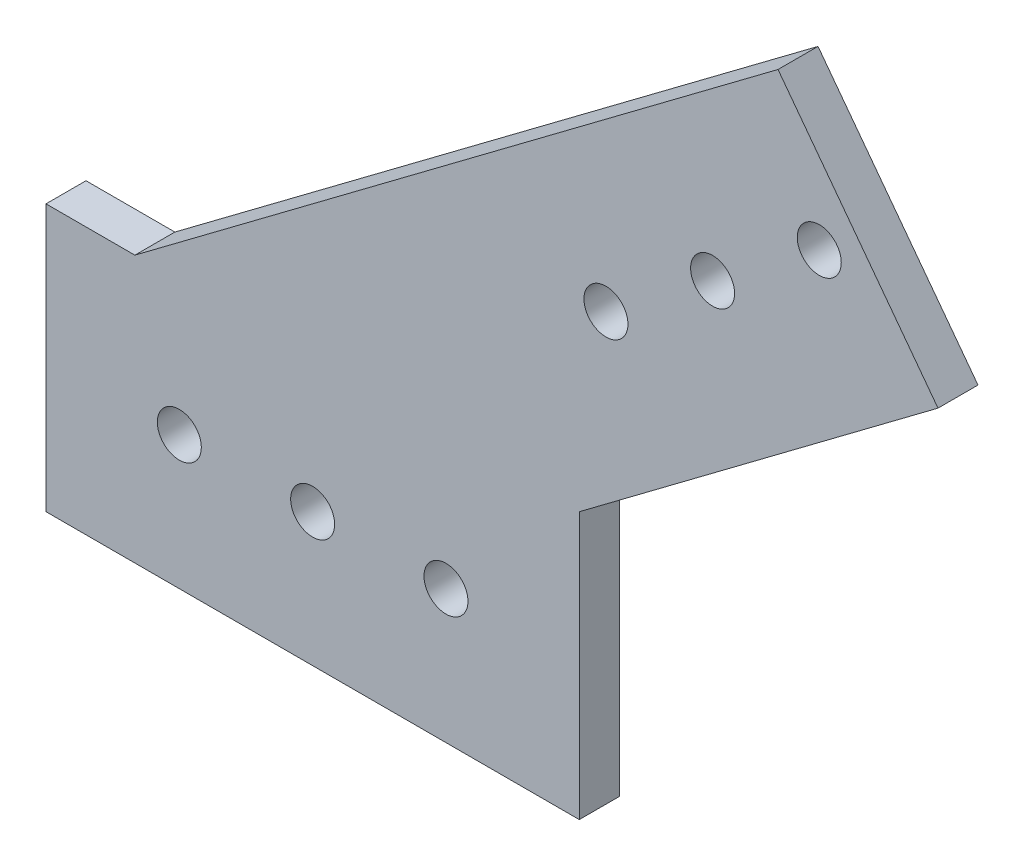
ISO-10303-21;
HEADER;
FILE_DESCRIPTION(('STEP AP214'),'2;1');
FILE_NAME('part.step','',(''),(''),'','','');
FILE_SCHEMA(('AUTOMOTIVE_DESIGN { 1 0 10303 214 1 1 1 1 }'));
ENDSEC;
DATA;
#1=APPLICATION_CONTEXT('core data for automotive mechanical design processes');
#2=APPLICATION_PROTOCOL_DEFINITION('international standard','automotive_design',2000,#1);
#3=PRODUCT_CONTEXT('',#1,'mechanical');
#4=PRODUCT('Part','Part','',(#3));
#5=PRODUCT_RELATED_PRODUCT_CATEGORY('part','',(#4));
#6=PRODUCT_DEFINITION_FORMATION('','',#4);
#7=PRODUCT_DEFINITION_CONTEXT('part definition',#1,'design');
#8=PRODUCT_DEFINITION('design','',#6,#7);
#9=PRODUCT_DEFINITION_SHAPE('','',#8);
#10=(LENGTH_UNIT() NAMED_UNIT(*) SI_UNIT(.MILLI.,.METRE.));
#11=(NAMED_UNIT(*) PLANE_ANGLE_UNIT() SI_UNIT($,.RADIAN.));
#12=(NAMED_UNIT(*) SI_UNIT($,.STERADIAN.) SOLID_ANGLE_UNIT());
#13=UNCERTAINTY_MEASURE_WITH_UNIT(LENGTH_MEASURE(1.E-05),#10,'distance_accuracy_value','');
#14=(GEOMETRIC_REPRESENTATION_CONTEXT(3) GLOBAL_UNCERTAINTY_ASSIGNED_CONTEXT((#13)) GLOBAL_UNIT_ASSIGNED_CONTEXT((#10,
#11,#12)) REPRESENTATION_CONTEXT('',''));
#15=CARTESIAN_POINT('',(0.,0.,0.));
#16=DIRECTION('',(0.,0.,1.));
#17=DIRECTION('',(1.,0.,0.));
#18=AXIS2_PLACEMENT_3D('',#15,#16,#17);
#19=CARTESIAN_POINT('',(0.,0.,3.));
#20=DIRECTION('',(0.,0.,-1.));
#21=DIRECTION('',(-1.,0.,0.));
#22=AXIS2_PLACEMENT_3D('',#19,#20,#21);
#23=PLANE('',#22);
#24=DIRECTION('',(0.79999993862181,0.600000081837578,0.));
#25=VECTOR('',#24,1.);
#26=CARTESIAN_POINT('',(14.5026314242211,-8.06225338048749,3.));
#27=LINE('',#26,#25);
#28=CARTESIAN_POINT('',(14.5026314242211,-8.06225338048749,3.));
#29=VERTEX_POINT('',#28);
#30=CARTESIAN_POINT('',(41.4088510684025,12.1174156533128,3.));
#31=VERTEX_POINT('',#30);
#32=EDGE_CURVE('E145',#29,#31,#27,.T.);
#33=ORIENTED_EDGE('',*,*,#32,.T.);
#34=DIRECTION('',(-0.600000081837578,0.79999993862181,0.));
#35=VECTOR('',#34,1.);
#36=CARTESIAN_POINT('',(29.4088494316509,28.1174144257491,3.));
#37=LINE('',#36,#35);
#38=CARTESIAN_POINT('',(29.4088494316509,28.1174144257491,3.));
#39=VERTEX_POINT('',#38);
#40=EDGE_CURVE('E98',#31,#39,#37,.T.);
#41=ORIENTED_EDGE('',*,*,#40,.T.);
#42=DIRECTION('',(-0.79999993862181,-0.600000081837578,0.));
#43=VECTOR('',#42,1.);
#44=CARTESIAN_POINT('',(-18.8306973625809,-8.06225338048749,3.));
#45=LINE('',#44,#43);
#46=CARTESIAN_POINT('',(-18.8306973625809,-8.06225338048749,3.));
#47=VERTEX_POINT('',#46);
#48=EDGE_CURVE('E157',#39,#47,#45,.T.);
#49=ORIENTED_EDGE('',*,*,#48,.T.);
#50=DIRECTION('',(-1.,0.,0.));
#51=VECTOR('',#50,1.);
#52=CARTESIAN_POINT('',(-18.8306973625809,-8.06225338048749,3.));
#53=LINE('',#52,#51);
#54=CARTESIAN_POINT('',(-25.4973634609303,-8.06225338048749,3.));
#55=VERTEX_POINT('',#54);
#56=EDGE_CURVE('E114',#47,#55,#53,.T.);
#57=ORIENTED_EDGE('',*,*,#56,.T.);
#58=DIRECTION('',(0.,-1.,0.));
#59=VECTOR('',#58,1.);
#60=CARTESIAN_POINT('',(-25.4973634609303,-8.06225338048749,3.));
#61=LINE('',#60,#59);
#62=CARTESIAN_POINT('',(-25.4973634609303,-28.0622533804875,3.));
#63=VERTEX_POINT('',#62);
#64=EDGE_CURVE('E108',#55,#63,#61,.T.);
#65=ORIENTED_EDGE('',*,*,#64,.T.);
#66=DIRECTION('',(1.,0.,0.));
#67=VECTOR('',#66,1.);
#68=CARTESIAN_POINT('',(-25.4973634609303,-28.0622533804875,3.));
#69=LINE('',#68,#67);
#70=CARTESIAN_POINT('',(14.5026314242211,-28.0622533804875,3.));
#71=VERTEX_POINT('',#70);
#72=EDGE_CURVE('E112',#63,#71,#69,.T.);
#73=ORIENTED_EDGE('',*,*,#72,.T.);
#74=DIRECTION('',(0.,1.,0.));
#75=VECTOR('',#74,1.);
#76=CARTESIAN_POINT('',(14.5026314242211,-28.0622533804875,3.));
#77=LINE('',#76,#75);
#78=EDGE_CURVE('E58',#71,#29,#77,.T.);
#79=ORIENTED_EDGE('',*,*,#78,.T.);
#80=EDGE_LOOP('',(#33,#41,#49,#57,#65,#73,#79));
#81=FACE_BOUND('',#80,.T.);
#82=CARTESIAN_POINT('',(-5.49736346093079,-18.0622533804874,3.));
#83=DIRECTION('',(0.,0.,1.));
#84=DIRECTION('',(1.,0.,0.));
#85=AXIS2_PLACEMENT_3D('',#82,#83,#84);
#86=CIRCLE('',#85,1.65000000000028);
#87=CARTESIAN_POINT('',(-3.84736346093051,-18.0622533804874,3.));
#88=VERTEX_POINT('',#87);
#89=EDGE_CURVE('E136',#88,#88,#86,.T.);
#90=ORIENTED_EDGE('',*,*,#89,.F.);
#91=EDGE_LOOP('',(#90));
#92=FACE_BOUND('',#91,.T.);
#93=CARTESIAN_POINT('',(4.502636539069,-18.0622533804874,3.));
#94=DIRECTION('',(0.,0.,1.));
#95=DIRECTION('',(1.,0.,0.));
#96=AXIS2_PLACEMENT_3D('',#93,#94,#95);
#97=CIRCLE('',#96,1.65000000000027);
#98=CARTESIAN_POINT('',(6.15263653906927,-18.0622533804874,3.));
#99=VERTEX_POINT('',#98);
#100=EDGE_CURVE('E172',#99,#99,#97,.T.);
#101=ORIENTED_EDGE('',*,*,#100,.F.);
#102=EDGE_LOOP('',(#101));
#103=FACE_BOUND('',#102,.T.);
#104=CARTESIAN_POINT('',(-15.4973634609306,-18.0622533804874,3.));
#105=DIRECTION('',(0.,0.,1.));
#106=DIRECTION('',(1.,0.,0.));
#107=AXIS2_PLACEMENT_3D('',#104,#105,#106);
#108=CIRCLE('',#107,1.65000000000027);
#109=CARTESIAN_POINT('',(-13.8473634609303,-18.0622533804874,3.));
#110=VERTEX_POINT('',#109);
#111=EDGE_CURVE('E178',#110,#110,#108,.T.);
#112=ORIENTED_EDGE('',*,*,#111,.F.);
#113=EDGE_LOOP('',(#112));
#114=FACE_BOUND('',#113,.T.);
#115=CARTESIAN_POINT('',(16.5026299920635,5.93774682410637,3.));
#116=DIRECTION('',(0.,0.,1.));
#117=DIRECTION('',(1.,0.,0.));
#118=AXIS2_PLACEMENT_3D('',#115,#116,#117);
#119=CIRCLE('',#118,1.65000000000024);
#120=CARTESIAN_POINT('',(18.1526299920637,5.93774682410637,3.));
#121=VERTEX_POINT('',#120);
#122=EDGE_CURVE('E184',#121,#121,#119,.T.);
#123=ORIENTED_EDGE('',*,*,#122,.F.);
#124=EDGE_LOOP('',(#123));
#125=FACE_BOUND('',#124,.T.);
#126=CARTESIAN_POINT('',(24.5026293782816,11.9377476424822,3.));
#127=DIRECTION('',(0.,0.,1.));
#128=DIRECTION('',(1.,0.,0.));
#129=AXIS2_PLACEMENT_3D('',#126,#127,#128);
#130=CIRCLE('',#129,1.6500000000003);
#131=CARTESIAN_POINT('',(26.1526293782819,11.9377476424822,3.));
#132=VERTEX_POINT('',#131);
#133=EDGE_CURVE('E190',#132,#132,#130,.T.);
#134=ORIENTED_EDGE('',*,*,#133,.F.);
#135=EDGE_LOOP('',(#134));
#136=FACE_BOUND('',#135,.T.);
#137=CARTESIAN_POINT('',(32.5026287644997,17.9377484608579,3.));
#138=DIRECTION('',(0.,0.,1.));
#139=DIRECTION('',(1.,0.,0.));
#140=AXIS2_PLACEMENT_3D('',#137,#138,#139);
#141=CIRCLE('',#140,1.65000000000022);
#142=CARTESIAN_POINT('',(34.1526287644999,17.9377484608579,3.));
#143=VERTEX_POINT('',#142);
#144=EDGE_CURVE('E196',#143,#143,#141,.T.);
#145=ORIENTED_EDGE('',*,*,#144,.F.);
#146=EDGE_LOOP('',(#145));
#147=FACE_BOUND('',#146,.T.);
#148=ADVANCED_FACE('F41',(#81,#92,#103,#114,#125,#136,#147),#23,.F.);
#149=CARTESIAN_POINT('',(0.,0.,0.));
#150=DIRECTION('',(0.,0.,-1.));
#151=DIRECTION('',(-1.,0.,0.));
#152=AXIS2_PLACEMENT_3D('',#149,#150,#151);
#153=PLANE('',#152);
#154=CARTESIAN_POINT('',(24.5026293782816,11.9377476424822,0.));
#155=DIRECTION('',(0.,0.,1.));
#156=DIRECTION('',(1.,0.,0.));
#157=AXIS2_PLACEMENT_3D('',#154,#155,#156);
#158=CIRCLE('',#157,1.6500000000003);
#159=CARTESIAN_POINT('',(26.1526293782819,11.9377476424822,0.));
#160=VERTEX_POINT('',#159);
#161=EDGE_CURVE('E193',#160,#160,#158,.T.);
#162=ORIENTED_EDGE('',*,*,#161,.T.);
#163=EDGE_LOOP('',(#162));
#164=FACE_BOUND('',#163,.T.);
#165=CARTESIAN_POINT('',(-15.4973634609306,-18.0622533804874,0.));
#166=DIRECTION('',(0.,0.,1.));
#167=DIRECTION('',(1.,0.,0.));
#168=AXIS2_PLACEMENT_3D('',#165,#166,#167);
#169=CIRCLE('',#168,1.65000000000027);
#170=CARTESIAN_POINT('',(-13.8473634609303,-18.0622533804874,0.));
#171=VERTEX_POINT('',#170);
#172=EDGE_CURVE('E181',#171,#171,#169,.T.);
#173=ORIENTED_EDGE('',*,*,#172,.T.);
#174=EDGE_LOOP('',(#173));
#175=FACE_BOUND('',#174,.T.);
#176=CARTESIAN_POINT('',(-5.49736346093079,-18.0622533804874,0.));
#177=DIRECTION('',(0.,0.,1.));
#178=DIRECTION('',(1.,0.,0.));
#179=AXIS2_PLACEMENT_3D('',#176,#177,#178);
#180=CIRCLE('',#179,1.65000000000028);
#181=CARTESIAN_POINT('',(-3.84736346093051,-18.0622533804874,0.));
#182=VERTEX_POINT('',#181);
#183=EDGE_CURVE('E169',#182,#182,#180,.T.);
#184=ORIENTED_EDGE('',*,*,#183,.T.);
#185=EDGE_LOOP('',(#184));
#186=FACE_BOUND('',#185,.T.);
#187=DIRECTION('',(0.79999993862181,0.600000081837578,0.));
#188=VECTOR('',#187,1.);
#189=CARTESIAN_POINT('',(14.5026314242211,-8.06225338048749,0.));
#190=LINE('',#189,#188);
#191=CARTESIAN_POINT('',(14.5026314242211,-8.06225338048749,0.));
#192=VERTEX_POINT('',#191);
#193=CARTESIAN_POINT('',(41.4088510684025,12.1174156533128,0.));
#194=VERTEX_POINT('',#193);
#195=EDGE_CURVE('E132',#192,#194,#190,.T.);
#196=ORIENTED_EDGE('',*,*,#195,.F.);
#197=DIRECTION('',(0.,1.,0.));
#198=VECTOR('',#197,1.);
#199=CARTESIAN_POINT('',(14.5026314242211,-28.0622533804875,0.));
#200=LINE('',#199,#198);
#201=CARTESIAN_POINT('',(14.5026314242211,-28.0622533804875,0.));
#202=VERTEX_POINT('',#201);
#203=EDGE_CURVE('E90',#202,#192,#200,.T.);
#204=ORIENTED_EDGE('',*,*,#203,.F.);
#205=DIRECTION('',(1.,0.,0.));
#206=VECTOR('',#205,1.);
#207=CARTESIAN_POINT('',(-25.4973634609303,-28.0622533804875,0.));
#208=LINE('',#207,#206);
#209=CARTESIAN_POINT('',(-25.4973634609303,-28.0622533804875,0.));
#210=VERTEX_POINT('',#209);
#211=EDGE_CURVE('E84',#210,#202,#208,.T.);
#212=ORIENTED_EDGE('',*,*,#211,.F.);
#213=DIRECTION('',(0.,-1.,0.));
#214=VECTOR('',#213,1.);
#215=CARTESIAN_POINT('',(-25.4973634609303,-8.06225338048749,0.));
#216=LINE('',#215,#214);
#217=CARTESIAN_POINT('',(-25.4973634609303,-8.06225338048749,0.));
#218=VERTEX_POINT('',#217);
#219=EDGE_CURVE('E122',#218,#210,#216,.T.);
#220=ORIENTED_EDGE('',*,*,#219,.F.);
#221=DIRECTION('',(-1.,0.,0.));
#222=VECTOR('',#221,1.);
#223=CARTESIAN_POINT('',(-18.8306973625809,-8.06225338048749,0.));
#224=LINE('',#223,#222);
#225=CARTESIAN_POINT('',(-18.8306973625809,-8.06225338048749,0.));
#226=VERTEX_POINT('',#225);
#227=EDGE_CURVE('E140',#226,#218,#224,.T.);
#228=ORIENTED_EDGE('',*,*,#227,.F.);
#229=DIRECTION('',(-0.79999993862181,-0.600000081837578,0.));
#230=VECTOR('',#229,1.);
#231=CARTESIAN_POINT('',(-18.8306973625809,-8.06225338048749,0.));
#232=LINE('',#231,#230);
#233=CARTESIAN_POINT('',(29.4088494316509,28.1174144257491,0.));
#234=VERTEX_POINT('',#233);
#235=EDGE_CURVE('E138',#234,#226,#232,.T.);
#236=ORIENTED_EDGE('',*,*,#235,.F.);
#237=DIRECTION('',(-0.600000081837578,0.79999993862181,0.));
#238=VECTOR('',#237,1.);
#239=CARTESIAN_POINT('',(29.4088494316509,28.1174144257491,0.));
#240=LINE('',#239,#238);
#241=EDGE_CURVE('E135',#194,#234,#240,.T.);
#242=ORIENTED_EDGE('',*,*,#241,.F.);
#243=EDGE_LOOP('',(#196,#204,#212,#220,#228,#236,#242));
#244=FACE_BOUND('',#243,.T.);
#245=CARTESIAN_POINT('',(4.502636539069,-18.0622533804874,0.));
#246=DIRECTION('',(0.,0.,1.));
#247=DIRECTION('',(1.,0.,0.));
#248=AXIS2_PLACEMENT_3D('',#245,#246,#247);
#249=CIRCLE('',#248,1.65000000000027);
#250=CARTESIAN_POINT('',(6.15263653906927,-18.0622533804874,0.));
#251=VERTEX_POINT('',#250);
#252=EDGE_CURVE('E175',#251,#251,#249,.T.);
#253=ORIENTED_EDGE('',*,*,#252,.T.);
#254=EDGE_LOOP('',(#253));
#255=FACE_BOUND('',#254,.T.);
#256=CARTESIAN_POINT('',(16.5026299920635,5.93774682410637,0.));
#257=DIRECTION('',(0.,0.,1.));
#258=DIRECTION('',(1.,0.,0.));
#259=AXIS2_PLACEMENT_3D('',#256,#257,#258);
#260=CIRCLE('',#259,1.65000000000024);
#261=CARTESIAN_POINT('',(18.1526299920637,5.93774682410637,0.));
#262=VERTEX_POINT('',#261);
#263=EDGE_CURVE('E187',#262,#262,#260,.T.);
#264=ORIENTED_EDGE('',*,*,#263,.T.);
#265=EDGE_LOOP('',(#264));
#266=FACE_BOUND('',#265,.T.);
#267=CARTESIAN_POINT('',(32.5026287644997,17.9377484608579,0.));
#268=DIRECTION('',(0.,0.,1.));
#269=DIRECTION('',(1.,0.,0.));
#270=AXIS2_PLACEMENT_3D('',#267,#268,#269);
#271=CIRCLE('',#270,1.65000000000022);
#272=CARTESIAN_POINT('',(34.1526287644999,17.9377484608579,0.));
#273=VERTEX_POINT('',#272);
#274=EDGE_CURVE('E199',#273,#273,#271,.T.);
#275=ORIENTED_EDGE('',*,*,#274,.T.);
#276=EDGE_LOOP('',(#275));
#277=FACE_BOUND('',#276,.T.);
#278=ADVANCED_FACE('F161',(#164,#175,#186,#244,#255,#266,#277),#153,.T.);
#279=CARTESIAN_POINT('',(14.5026314242211,-8.06225338048749,3.));
#280=DIRECTION('',(-0.600000081837578,0.79999993862181,0.));
#281=DIRECTION('',(-0.79999993862181,-0.600000081837578,0.));
#282=AXIS2_PLACEMENT_3D('',#279,#280,#281);
#283=PLANE('',#282);
#284=ORIENTED_EDGE('',*,*,#195,.T.);
#285=DIRECTION('',(0.,0.,-1.));
#286=VECTOR('',#285,1.);
#287=CARTESIAN_POINT('',(41.4088510684025,12.1174156533128,3.));
#288=LINE('',#287,#286);
#289=EDGE_CURVE('E11',#31,#194,#288,.T.);
#290=ORIENTED_EDGE('',*,*,#289,.F.);
#291=ORIENTED_EDGE('',*,*,#32,.F.);
#292=DIRECTION('',(0.,0.,-1.));
#293=VECTOR('',#292,1.);
#294=CARTESIAN_POINT('',(14.5026314242211,-8.06225338048749,3.));
#295=LINE('',#294,#293);
#296=EDGE_CURVE('E128',#29,#192,#295,.T.);
#297=ORIENTED_EDGE('',*,*,#296,.T.);
#298=EDGE_LOOP('',(#284,#290,#291,#297));
#299=FACE_BOUND('',#298,.T.);
#300=ADVANCED_FACE('F43',(#299),#283,.F.);
#301=CARTESIAN_POINT('',(29.4088494316509,28.1174144257491,3.));
#302=DIRECTION('',(-0.79999993862181,-0.600000081837578,0.));
#303=DIRECTION('',(0.600000081837578,-0.79999993862181,0.));
#304=AXIS2_PLACEMENT_3D('',#301,#302,#303);
#305=PLANE('',#304);
#306=ORIENTED_EDGE('',*,*,#241,.T.);
#307=DIRECTION('',(0.,0.,-1.));
#308=VECTOR('',#307,1.);
#309=CARTESIAN_POINT('',(29.4088494316509,28.1174144257491,3.));
#310=LINE('',#309,#308);
#311=EDGE_CURVE('E50',#39,#234,#310,.T.);
#312=ORIENTED_EDGE('',*,*,#311,.F.);
#313=ORIENTED_EDGE('',*,*,#40,.F.);
#314=ORIENTED_EDGE('',*,*,#289,.T.);
#315=EDGE_LOOP('',(#306,#312,#313,#314));
#316=FACE_BOUND('',#315,.T.);
#317=ADVANCED_FACE('F229',(#316),#305,.F.);
#318=CARTESIAN_POINT('',(-18.8306973625809,-8.06225338048749,3.));
#319=DIRECTION('',(0.600000081837578,-0.79999993862181,0.));
#320=DIRECTION('',(0.79999993862181,0.600000081837578,0.));
#321=AXIS2_PLACEMENT_3D('',#318,#319,#320);
#322=PLANE('',#321);
#323=ORIENTED_EDGE('',*,*,#235,.T.);
#324=DIRECTION('',(0.,0.,-1.));
#325=VECTOR('',#324,1.);
#326=CARTESIAN_POINT('',(-18.8306973625809,-8.06225338048749,3.));
#327=LINE('',#326,#325);
#328=EDGE_CURVE('E149',#47,#226,#327,.T.);
#329=ORIENTED_EDGE('',*,*,#328,.F.);
#330=ORIENTED_EDGE('',*,*,#48,.F.);
#331=ORIENTED_EDGE('',*,*,#311,.T.);
#332=EDGE_LOOP('',(#323,#329,#330,#331));
#333=FACE_BOUND('',#332,.T.);
#334=ADVANCED_FACE('F155',(#333),#322,.F.);
#335=CARTESIAN_POINT('',(-18.8306973625809,-8.06225338048749,3.));
#336=DIRECTION('',(0.,-1.,0.));
#337=DIRECTION('',(0.,0.,-1.));
#338=AXIS2_PLACEMENT_3D('',#335,#336,#337);
#339=PLANE('',#338);
#340=ORIENTED_EDGE('',*,*,#227,.T.);
#341=DIRECTION('',(0.,0.,-1.));
#342=VECTOR('',#341,1.);
#343=CARTESIAN_POINT('',(-25.4973634609303,-8.06225338048749,3.));
#344=LINE('',#343,#342);
#345=EDGE_CURVE('E123',#55,#218,#344,.T.);
#346=ORIENTED_EDGE('',*,*,#345,.F.);
#347=ORIENTED_EDGE('',*,*,#56,.F.);
#348=ORIENTED_EDGE('',*,*,#328,.T.);
#349=EDGE_LOOP('',(#340,#346,#347,#348));
#350=FACE_BOUND('',#349,.T.);
#351=ADVANCED_FACE('F164',(#350),#339,.F.);
#352=CARTESIAN_POINT('',(-25.4973634609303,-8.06225338048749,3.));
#353=DIRECTION('',(1.,0.,0.));
#354=DIRECTION('',(0.,0.,-1.));
#355=AXIS2_PLACEMENT_3D('',#352,#353,#354);
#356=PLANE('',#355);
#357=ORIENTED_EDGE('',*,*,#219,.T.);
#358=DIRECTION('',(0.,0.,-1.));
#359=VECTOR('',#358,1.);
#360=CARTESIAN_POINT('',(-25.4973634609303,-28.0622533804875,3.));
#361=LINE('',#360,#359);
#362=EDGE_CURVE('E119',#63,#210,#361,.T.);
#363=ORIENTED_EDGE('',*,*,#362,.F.);
#364=ORIENTED_EDGE('',*,*,#64,.F.);
#365=ORIENTED_EDGE('',*,*,#345,.T.);
#366=EDGE_LOOP('',(#357,#363,#364,#365));
#367=FACE_BOUND('',#366,.T.);
#368=ADVANCED_FACE('F120',(#367),#356,.F.);
#369=CARTESIAN_POINT('',(-25.4973634609303,-28.0622533804875,3.));
#370=DIRECTION('',(0.,1.,0.));
#371=DIRECTION('',(-1.,0.,0.));
#372=AXIS2_PLACEMENT_3D('',#369,#370,#371);
#373=PLANE('',#372);
#374=ORIENTED_EDGE('',*,*,#211,.T.);
#375=DIRECTION('',(0.,0.,-1.));
#376=VECTOR('',#375,1.);
#377=CARTESIAN_POINT('',(14.5026314242211,-28.0622533804875,3.));
#378=LINE('',#377,#376);
#379=EDGE_CURVE('E124',#71,#202,#378,.T.);
#380=ORIENTED_EDGE('',*,*,#379,.F.);
#381=ORIENTED_EDGE('',*,*,#72,.F.);
#382=ORIENTED_EDGE('',*,*,#362,.T.);
#383=EDGE_LOOP('',(#374,#380,#381,#382));
#384=FACE_BOUND('',#383,.T.);
#385=ADVANCED_FACE('F126',(#384),#373,.F.);
#386=CARTESIAN_POINT('',(14.5026314242211,-28.0622533804875,3.));
#387=DIRECTION('',(-1.,0.,0.));
#388=DIRECTION('',(0.,0.,1.));
#389=AXIS2_PLACEMENT_3D('',#386,#387,#388);
#390=PLANE('',#389);
#391=ORIENTED_EDGE('',*,*,#203,.T.);
#392=ORIENTED_EDGE('',*,*,#296,.F.);
#393=ORIENTED_EDGE('',*,*,#78,.F.);
#394=ORIENTED_EDGE('',*,*,#379,.T.);
#395=EDGE_LOOP('',(#391,#392,#393,#394));
#396=FACE_BOUND('',#395,.T.);
#397=ADVANCED_FACE('F219',(#396),#390,.F.);
#398=CARTESIAN_POINT('',(-5.49736346093079,-18.0622533804874,3.));
#399=DIRECTION('',(0.,0.,-1.));
#400=DIRECTION('',(-1.,0.,0.));
#401=AXIS2_PLACEMENT_3D('',#398,#399,#400);
#402=CYLINDRICAL_SURFACE('',#401,1.65000000000028);
#403=ORIENTED_EDGE('',*,*,#89,.T.);
#404=EDGE_LOOP('',(#403));
#405=FACE_BOUND('',#404,.T.);
#406=ORIENTED_EDGE('',*,*,#183,.F.);
#407=EDGE_LOOP('',(#406));
#408=FACE_BOUND('',#407,.T.);
#409=ADVANCED_FACE('F216',(#405,#408),#402,.F.);
#410=CARTESIAN_POINT('',(4.502636539069,-18.0622533804874,3.));
#411=DIRECTION('',(0.,0.,-1.));
#412=DIRECTION('',(-1.,0.,0.));
#413=AXIS2_PLACEMENT_3D('',#410,#411,#412);
#414=CYLINDRICAL_SURFACE('',#413,1.65000000000027);
#415=ORIENTED_EDGE('',*,*,#100,.T.);
#416=EDGE_LOOP('',(#415));
#417=FACE_BOUND('',#416,.T.);
#418=ORIENTED_EDGE('',*,*,#252,.F.);
#419=EDGE_LOOP('',(#418));
#420=FACE_BOUND('',#419,.T.);
#421=ADVANCED_FACE('F287',(#417,#420),#414,.F.);
#422=CARTESIAN_POINT('',(-15.4973634609306,-18.0622533804874,3.));
#423=DIRECTION('',(0.,0.,-1.));
#424=DIRECTION('',(-1.,0.,0.));
#425=AXIS2_PLACEMENT_3D('',#422,#423,#424);
#426=CYLINDRICAL_SURFACE('',#425,1.65000000000027);
#427=ORIENTED_EDGE('',*,*,#111,.T.);
#428=EDGE_LOOP('',(#427));
#429=FACE_BOUND('',#428,.T.);
#430=ORIENTED_EDGE('',*,*,#172,.F.);
#431=EDGE_LOOP('',(#430));
#432=FACE_BOUND('',#431,.T.);
#433=ADVANCED_FACE('F295',(#429,#432),#426,.F.);
#434=CARTESIAN_POINT('',(16.5026299920635,5.93774682410637,3.));
#435=DIRECTION('',(0.,0.,-1.));
#436=DIRECTION('',(-1.,0.,0.));
#437=AXIS2_PLACEMENT_3D('',#434,#435,#436);
#438=CYLINDRICAL_SURFACE('',#437,1.65000000000024);
#439=ORIENTED_EDGE('',*,*,#122,.T.);
#440=EDGE_LOOP('',(#439));
#441=FACE_BOUND('',#440,.T.);
#442=ORIENTED_EDGE('',*,*,#263,.F.);
#443=EDGE_LOOP('',(#442));
#444=FACE_BOUND('',#443,.T.);
#445=ADVANCED_FACE('F303',(#441,#444),#438,.F.);
#446=CARTESIAN_POINT('',(24.5026293782816,11.9377476424822,3.));
#447=DIRECTION('',(0.,0.,-1.));
#448=DIRECTION('',(-1.,0.,0.));
#449=AXIS2_PLACEMENT_3D('',#446,#447,#448);
#450=CYLINDRICAL_SURFACE('',#449,1.6500000000003);
#451=ORIENTED_EDGE('',*,*,#133,.T.);
#452=EDGE_LOOP('',(#451));
#453=FACE_BOUND('',#452,.T.);
#454=ORIENTED_EDGE('',*,*,#161,.F.);
#455=EDGE_LOOP('',(#454));
#456=FACE_BOUND('',#455,.T.);
#457=ADVANCED_FACE('F312',(#453,#456),#450,.F.);
#458=CARTESIAN_POINT('',(32.5026287644997,17.9377484608579,3.));
#459=DIRECTION('',(0.,0.,-1.));
#460=DIRECTION('',(-1.,0.,0.));
#461=AXIS2_PLACEMENT_3D('',#458,#459,#460);
#462=CYLINDRICAL_SURFACE('',#461,1.65000000000022);
#463=ORIENTED_EDGE('',*,*,#144,.T.);
#464=EDGE_LOOP('',(#463));
#465=FACE_BOUND('',#464,.T.);
#466=ORIENTED_EDGE('',*,*,#274,.F.);
#467=EDGE_LOOP('',(#466));
#468=FACE_BOUND('',#467,.T.);
#469=ADVANCED_FACE('F205',(#465,#468),#462,.F.);
#470=CLOSED_SHELL('',(#148,#278,#300,#317,#334,#351,#368,#385,#397,#409,#421,#433,#445,#457,#469));
#471=MANIFOLD_SOLID_BREP('B2',#470);
#472=ADVANCED_BREP_SHAPE_REPRESENTATION('',(#18,#471),#14);
#473=SHAPE_DEFINITION_REPRESENTATION(#9,#472);
ENDSEC;
END-ISO-10303-21;
